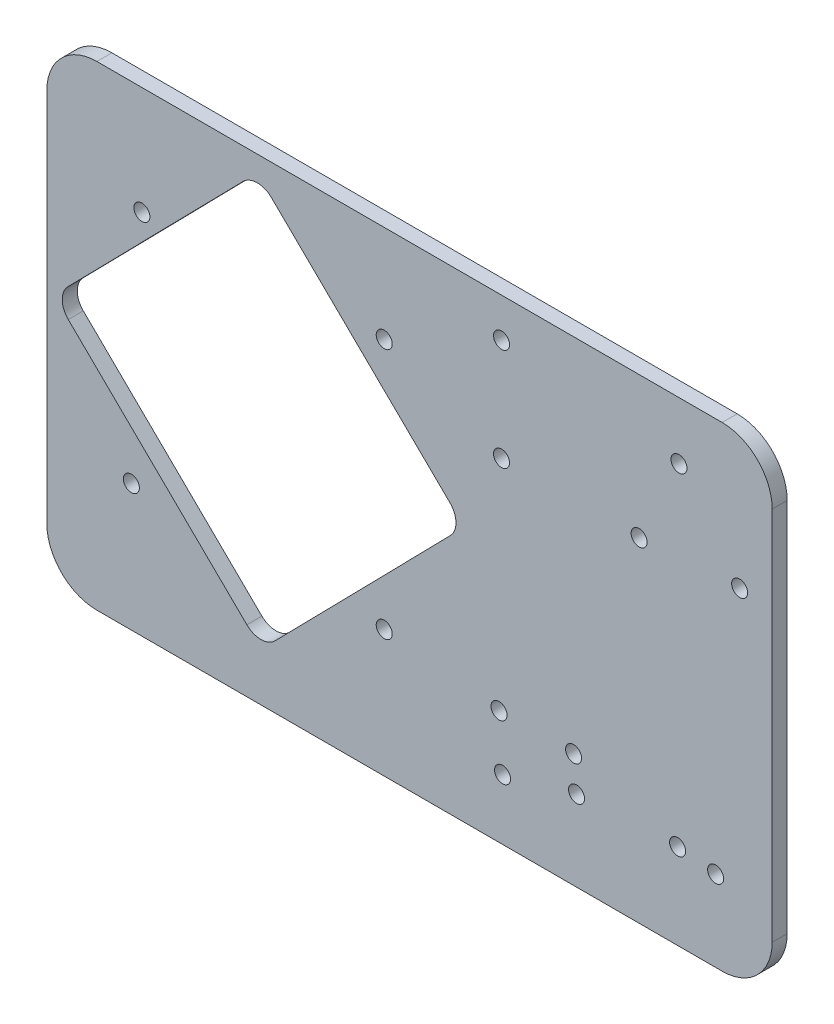
ISO-10303-21;
HEADER;
FILE_DESCRIPTION(('STEP AP214'),'2;1');
FILE_NAME('part.step','',(''),(''),'','','');
FILE_SCHEMA(('AUTOMOTIVE_DESIGN { 1 0 10303 214 1 1 1 1 }'));
ENDSEC;
DATA;
#1=APPLICATION_CONTEXT('core data for automotive mechanical design processes');
#2=APPLICATION_PROTOCOL_DEFINITION('international standard','automotive_design',2000,#1);
#3=PRODUCT_CONTEXT('',#1,'mechanical');
#4=PRODUCT('Part','Part','',(#3));
#5=PRODUCT_RELATED_PRODUCT_CATEGORY('part','',(#4));
#6=PRODUCT_DEFINITION_FORMATION('','',#4);
#7=PRODUCT_DEFINITION_CONTEXT('part definition',#1,'design');
#8=PRODUCT_DEFINITION('design','',#6,#7);
#9=PRODUCT_DEFINITION_SHAPE('','',#8);
#10=(LENGTH_UNIT() NAMED_UNIT(*) SI_UNIT(.MILLI.,.METRE.));
#11=(NAMED_UNIT(*) PLANE_ANGLE_UNIT() SI_UNIT($,.RADIAN.));
#12=(NAMED_UNIT(*) SI_UNIT($,.STERADIAN.) SOLID_ANGLE_UNIT());
#13=UNCERTAINTY_MEASURE_WITH_UNIT(LENGTH_MEASURE(1.E-05),#10,'distance_accuracy_value','');
#14=(GEOMETRIC_REPRESENTATION_CONTEXT(3) GLOBAL_UNCERTAINTY_ASSIGNED_CONTEXT((#13)) GLOBAL_UNIT_ASSIGNED_CONTEXT((#10,
#11,#12)) REPRESENTATION_CONTEXT('',''));
#15=CARTESIAN_POINT('',(0.,0.,0.));
#16=DIRECTION('',(0.,0.,1.));
#17=DIRECTION('',(1.,0.,0.));
#18=AXIS2_PLACEMENT_3D('',#15,#16,#17);
#19=CARTESIAN_POINT('',(135.,85.,-3.));
#20=DIRECTION('',(0.,0.,1.));
#21=DIRECTION('',(1.,0.,0.));
#22=AXIS2_PLACEMENT_3D('',#19,#20,#21);
#23=CYLINDRICAL_SURFACE('',#22,10.);
#24=CARTESIAN_POINT('',(135.,85.,0.));
#25=DIRECTION('',(0.,0.,1.));
#26=DIRECTION('',(-1.,0.,0.));
#27=AXIS2_PLACEMENT_3D('',#24,#25,#26);
#28=CIRCLE('',#27,10.);
#29=CARTESIAN_POINT('',(145.,84.9999999999999,0.));
#30=VERTEX_POINT('',#29);
#31=CARTESIAN_POINT('',(135.,95.,0.));
#32=VERTEX_POINT('',#31);
#33=EDGE_CURVE('E227',#30,#32,#28,.T.);
#34=ORIENTED_EDGE('',*,*,#33,.F.);
#35=DIRECTION('',(0.,0.,1.));
#36=VECTOR('',#35,1.);
#37=CARTESIAN_POINT('',(145.,84.9999999999999,-3.));
#38=LINE('',#37,#36);
#39=CARTESIAN_POINT('',(145.,84.9999999999999,-3.));
#40=VERTEX_POINT('',#39);
#41=EDGE_CURVE('E11',#40,#30,#38,.T.);
#42=ORIENTED_EDGE('',*,*,#41,.F.);
#43=CARTESIAN_POINT('',(135.,85.,-3.));
#44=DIRECTION('',(0.,0.,1.));
#45=DIRECTION('',(-1.,0.,0.));
#46=AXIS2_PLACEMENT_3D('',#43,#44,#45);
#47=CIRCLE('',#46,10.);
#48=CARTESIAN_POINT('',(135.,95.,-3.));
#49=VERTEX_POINT('',#48);
#50=EDGE_CURVE('E230',#40,#49,#47,.T.);
#51=ORIENTED_EDGE('',*,*,#50,.T.);
#52=DIRECTION('',(0.,0.,1.));
#53=VECTOR('',#52,1.);
#54=CARTESIAN_POINT('',(135.,95.,-3.));
#55=LINE('',#54,#53);
#56=EDGE_CURVE('E41',#49,#32,#55,.T.);
#57=ORIENTED_EDGE('',*,*,#56,.T.);
#58=EDGE_LOOP('',(#34,#42,#51,#57));
#59=FACE_BOUND('',#58,.T.);
#60=ADVANCED_FACE('F38',(#59),#23,.T.);
#61=CARTESIAN_POINT('',(145.,10.0000000000001,-3.));
#62=DIRECTION('',(1.,0.,0.));
#63=DIRECTION('',(0.,0.,-1.));
#64=AXIS2_PLACEMENT_3D('',#61,#62,#63);
#65=PLANE('',#64);
#66=DIRECTION('',(0.,1.,0.));
#67=VECTOR('',#66,1.);
#68=CARTESIAN_POINT('',(145.,10.0000000000001,0.));
#69=LINE('',#68,#67);
#70=CARTESIAN_POINT('',(145.,10.,0.));
#71=VERTEX_POINT('',#70);
#72=EDGE_CURVE('E234',#71,#30,#69,.T.);
#73=ORIENTED_EDGE('',*,*,#72,.F.);
#74=DIRECTION('',(0.,0.,1.));
#75=VECTOR('',#74,1.);
#76=CARTESIAN_POINT('',(145.,10.,-3.));
#77=LINE('',#76,#75);
#78=CARTESIAN_POINT('',(145.,10.,-3.));
#79=VERTEX_POINT('',#78);
#80=EDGE_CURVE('E46',#79,#71,#77,.T.);
#81=ORIENTED_EDGE('',*,*,#80,.F.);
#82=DIRECTION('',(0.,1.,0.));
#83=VECTOR('',#82,1.);
#84=CARTESIAN_POINT('',(145.,10.0000000000001,-3.));
#85=LINE('',#84,#83);
#86=EDGE_CURVE('E252',#79,#40,#85,.T.);
#87=ORIENTED_EDGE('',*,*,#86,.T.);
#88=ORIENTED_EDGE('',*,*,#41,.T.);
#89=EDGE_LOOP('',(#73,#81,#87,#88));
#90=FACE_BOUND('',#89,.T.);
#91=ADVANCED_FACE('F299',(#90),#65,.T.);
#92=CARTESIAN_POINT('',(135.,10.,-3.));
#93=DIRECTION('',(0.,0.,1.));
#94=DIRECTION('',(1.,0.,0.));
#95=AXIS2_PLACEMENT_3D('',#92,#93,#94);
#96=CYLINDRICAL_SURFACE('',#95,10.);
#97=CARTESIAN_POINT('',(135.,10.,0.));
#98=DIRECTION('',(0.,0.,1.));
#99=DIRECTION('',(1.,0.,0.));
#100=AXIS2_PLACEMENT_3D('',#97,#98,#99);
#101=CIRCLE('',#100,10.);
#102=CARTESIAN_POINT('',(135.,0.,0.));
#103=VERTEX_POINT('',#102);
#104=EDGE_CURVE('E272',#103,#71,#101,.T.);
#105=ORIENTED_EDGE('',*,*,#104,.F.);
#106=DIRECTION('',(0.,0.,1.));
#107=VECTOR('',#106,1.);
#108=CARTESIAN_POINT('',(135.,0.,-3.));
#109=LINE('',#108,#107);
#110=CARTESIAN_POINT('',(135.,0.,-3.));
#111=VERTEX_POINT('',#110);
#112=EDGE_CURVE('E278',#111,#103,#109,.T.);
#113=ORIENTED_EDGE('',*,*,#112,.F.);
#114=CARTESIAN_POINT('',(135.,10.,-3.));
#115=DIRECTION('',(0.,0.,1.));
#116=DIRECTION('',(1.,0.,0.));
#117=AXIS2_PLACEMENT_3D('',#114,#115,#116);
#118=CIRCLE('',#117,10.);
#119=EDGE_CURVE('E249',#111,#79,#118,.T.);
#120=ORIENTED_EDGE('',*,*,#119,.T.);
#121=ORIENTED_EDGE('',*,*,#80,.T.);
#122=EDGE_LOOP('',(#105,#113,#120,#121));
#123=FACE_BOUND('',#122,.T.);
#124=ADVANCED_FACE('F319',(#123),#96,.T.);
#125=CARTESIAN_POINT('',(10.0000000000001,0.,-3.));
#126=DIRECTION('',(0.,-1.,0.));
#127=DIRECTION('',(0.,0.,-1.));
#128=AXIS2_PLACEMENT_3D('',#125,#126,#127);
#129=PLANE('',#128);
#130=DIRECTION('',(1.,0.,0.));
#131=VECTOR('',#130,1.);
#132=CARTESIAN_POINT('',(10.0000000000001,0.,0.));
#133=LINE('',#132,#131);
#134=CARTESIAN_POINT('',(10.0000000000001,0.,0.));
#135=VERTEX_POINT('',#134);
#136=EDGE_CURVE('E269',#135,#103,#133,.T.);
#137=ORIENTED_EDGE('',*,*,#136,.F.);
#138=DIRECTION('',(0.,0.,1.));
#139=VECTOR('',#138,1.);
#140=CARTESIAN_POINT('',(10.0000000000001,0.,-3.));
#141=LINE('',#140,#139);
#142=CARTESIAN_POINT('',(10.0000000000001,0.,-3.));
#143=VERTEX_POINT('',#142);
#144=EDGE_CURVE('E280',#143,#135,#141,.T.);
#145=ORIENTED_EDGE('',*,*,#144,.F.);
#146=DIRECTION('',(1.,0.,0.));
#147=VECTOR('',#146,1.);
#148=CARTESIAN_POINT('',(10.0000000000001,0.,-3.));
#149=LINE('',#148,#147);
#150=EDGE_CURVE('E246',#143,#111,#149,.T.);
#151=ORIENTED_EDGE('',*,*,#150,.T.);
#152=ORIENTED_EDGE('',*,*,#112,.T.);
#153=EDGE_LOOP('',(#137,#145,#151,#152));
#154=FACE_BOUND('',#153,.T.);
#155=ADVANCED_FACE('F317',(#154),#129,.T.);
#156=CARTESIAN_POINT('',(10.,10.,-3.));
#157=DIRECTION('',(0.,0.,1.));
#158=DIRECTION('',(1.,0.,0.));
#159=AXIS2_PLACEMENT_3D('',#156,#157,#158);
#160=CYLINDRICAL_SURFACE('',#159,10.);
#161=CARTESIAN_POINT('',(10.,10.,0.));
#162=DIRECTION('',(0.,0.,1.));
#163=DIRECTION('',(-1.,0.,0.));
#164=AXIS2_PLACEMENT_3D('',#161,#162,#163);
#165=CIRCLE('',#164,10.);
#166=CARTESIAN_POINT('',(0.,10.0000000000001,0.));
#167=VERTEX_POINT('',#166);
#168=EDGE_CURVE('E266',#167,#135,#165,.T.);
#169=ORIENTED_EDGE('',*,*,#168,.F.);
#170=DIRECTION('',(0.,0.,1.));
#171=VECTOR('',#170,1.);
#172=CARTESIAN_POINT('',(0.,10.0000000000001,-3.));
#173=LINE('',#172,#171);
#174=CARTESIAN_POINT('',(0.,10.0000000000001,-3.));
#175=VERTEX_POINT('',#174);
#176=EDGE_CURVE('E282',#175,#167,#173,.T.);
#177=ORIENTED_EDGE('',*,*,#176,.F.);
#178=CARTESIAN_POINT('',(10.,10.,-3.));
#179=DIRECTION('',(0.,0.,1.));
#180=DIRECTION('',(-1.,0.,0.));
#181=AXIS2_PLACEMENT_3D('',#178,#179,#180);
#182=CIRCLE('',#181,10.);
#183=EDGE_CURVE('E243',#175,#143,#182,.T.);
#184=ORIENTED_EDGE('',*,*,#183,.T.);
#185=ORIENTED_EDGE('',*,*,#144,.T.);
#186=EDGE_LOOP('',(#169,#177,#184,#185));
#187=FACE_BOUND('',#186,.T.);
#188=ADVANCED_FACE('F313',(#187),#160,.T.);
#189=CARTESIAN_POINT('',(0.,10.0000000000001,-3.));
#190=DIRECTION('',(-1.,0.,0.));
#191=DIRECTION('',(0.,0.,1.));
#192=AXIS2_PLACEMENT_3D('',#189,#190,#191);
#193=PLANE('',#192);
#194=DIRECTION('',(0.,-1.,0.));
#195=VECTOR('',#194,1.);
#196=CARTESIAN_POINT('',(0.,10.0000000000001,0.));
#197=LINE('',#196,#195);
#198=CARTESIAN_POINT('',(0.,84.9999999999999,0.));
#199=VERTEX_POINT('',#198);
#200=EDGE_CURVE('E263',#199,#167,#197,.T.);
#201=ORIENTED_EDGE('',*,*,#200,.F.);
#202=DIRECTION('',(0.,0.,1.));
#203=VECTOR('',#202,1.);
#204=CARTESIAN_POINT('',(0.,84.9999999999999,-3.));
#205=LINE('',#204,#203);
#206=CARTESIAN_POINT('',(0.,84.9999999999999,-3.));
#207=VERTEX_POINT('',#206);
#208=EDGE_CURVE('E284',#207,#199,#205,.T.);
#209=ORIENTED_EDGE('',*,*,#208,.F.);
#210=DIRECTION('',(0.,-1.,0.));
#211=VECTOR('',#210,1.);
#212=CARTESIAN_POINT('',(0.,10.0000000000001,-3.));
#213=LINE('',#212,#211);
#214=EDGE_CURVE('E240',#207,#175,#213,.T.);
#215=ORIENTED_EDGE('',*,*,#214,.T.);
#216=ORIENTED_EDGE('',*,*,#176,.T.);
#217=EDGE_LOOP('',(#201,#209,#215,#216));
#218=FACE_BOUND('',#217,.T.);
#219=ADVANCED_FACE('F311',(#218),#193,.T.);
#220=CARTESIAN_POINT('',(10.,85.,-3.));
#221=DIRECTION('',(0.,0.,1.));
#222=DIRECTION('',(1.,0.,0.));
#223=AXIS2_PLACEMENT_3D('',#220,#221,#222);
#224=CYLINDRICAL_SURFACE('',#223,10.);
#225=CARTESIAN_POINT('',(10.,85.,0.));
#226=DIRECTION('',(0.,0.,1.));
#227=DIRECTION('',(-1.,0.,0.));
#228=AXIS2_PLACEMENT_3D('',#225,#226,#227);
#229=CIRCLE('',#228,10.);
#230=CARTESIAN_POINT('',(10.0000000000001,95.,0.));
#231=VERTEX_POINT('',#230);
#232=EDGE_CURVE('E260',#231,#199,#229,.T.);
#233=ORIENTED_EDGE('',*,*,#232,.F.);
#234=DIRECTION('',(0.,0.,1.));
#235=VECTOR('',#234,1.);
#236=CARTESIAN_POINT('',(10.0000000000001,95.,-3.));
#237=LINE('',#236,#235);
#238=CARTESIAN_POINT('',(10.0000000000001,95.,-3.));
#239=VERTEX_POINT('',#238);
#240=EDGE_CURVE('E285',#239,#231,#237,.T.);
#241=ORIENTED_EDGE('',*,*,#240,.F.);
#242=CARTESIAN_POINT('',(10.,85.,-3.));
#243=DIRECTION('',(0.,0.,1.));
#244=DIRECTION('',(-1.,0.,0.));
#245=AXIS2_PLACEMENT_3D('',#242,#243,#244);
#246=CIRCLE('',#245,10.);
#247=EDGE_CURVE('E237',#239,#207,#246,.T.);
#248=ORIENTED_EDGE('',*,*,#247,.T.);
#249=ORIENTED_EDGE('',*,*,#208,.T.);
#250=EDGE_LOOP('',(#233,#241,#248,#249));
#251=FACE_BOUND('',#250,.T.);
#252=ADVANCED_FACE('F307',(#251),#224,.T.);
#253=CARTESIAN_POINT('',(10.0000000000001,95.,-3.));
#254=DIRECTION('',(0.,1.,0.));
#255=DIRECTION('',(0.,0.,1.));
#256=AXIS2_PLACEMENT_3D('',#253,#254,#255);
#257=PLANE('',#256);
#258=DIRECTION('',(-1.,0.,0.));
#259=VECTOR('',#258,1.);
#260=CARTESIAN_POINT('',(10.0000000000001,95.,0.));
#261=LINE('',#260,#259);
#262=EDGE_CURVE('E257',#32,#231,#261,.T.);
#263=ORIENTED_EDGE('',*,*,#262,.F.);
#264=ORIENTED_EDGE('',*,*,#56,.F.);
#265=DIRECTION('',(-1.,0.,0.));
#266=VECTOR('',#265,1.);
#267=CARTESIAN_POINT('',(10.0000000000001,95.,-3.));
#268=LINE('',#267,#266);
#269=EDGE_CURVE('E233',#49,#239,#268,.T.);
#270=ORIENTED_EDGE('',*,*,#269,.T.);
#271=ORIENTED_EDGE('',*,*,#240,.T.);
#272=EDGE_LOOP('',(#263,#264,#270,#271));
#273=FACE_BOUND('',#272,.T.);
#274=ADVANCED_FACE('F293',(#273),#257,.T.);
#275=CARTESIAN_POINT('',(135.,85.,-3.));
#276=DIRECTION('',(0.,0.,-1.));
#277=DIRECTION('',(-1.,0.,0.));
#278=AXIS2_PLACEMENT_3D('',#275,#276,#277);
#279=PLANE('',#278);
#280=CARTESIAN_POINT('',(16.9,25.4,-3.));
#281=DIRECTION('',(0.,0.,1.));
#282=DIRECTION('',(1.,0.,0.));
#283=AXIS2_PLACEMENT_3D('',#280,#281,#282);
#284=CIRCLE('',#283,1.60000000000001);
#285=CARTESIAN_POINT('',(18.5,25.4,-3.));
#286=VERTEX_POINT('',#285);
#287=EDGE_CURVE('E694',#286,#286,#284,.T.);
#288=ORIENTED_EDGE('',*,*,#287,.T.);
#289=EDGE_LOOP('',(#288));
#290=FACE_BOUND('',#289,.T.);
#291=CARTESIAN_POINT('',(105.9,16.1,-3.));
#292=DIRECTION('',(0.,0.,1.));
#293=DIRECTION('',(1.,0.,0.));
#294=AXIS2_PLACEMENT_3D('',#291,#292,#293);
#295=CIRCLE('',#294,1.6);
#296=CARTESIAN_POINT('',(107.5,16.1,-3.));
#297=VERTEX_POINT('',#296);
#298=EDGE_CURVE('E702',#297,#297,#295,.T.);
#299=ORIENTED_EDGE('',*,*,#298,.T.);
#300=EDGE_LOOP('',(#299));
#301=FACE_BOUND('',#300,.T.);
#302=CARTESIAN_POINT('',(67.45,75.6,-3.));
#303=DIRECTION('',(0.,0.,1.));
#304=DIRECTION('',(1.,0.,0.));
#305=AXIS2_PLACEMENT_3D('',#302,#303,#304);
#306=CIRCLE('',#305,1.60000000000001);
#307=CARTESIAN_POINT('',(69.05,75.6,-3.));
#308=VERTEX_POINT('',#307);
#309=EDGE_CURVE('E708',#308,#308,#306,.T.);
#310=ORIENTED_EDGE('',*,*,#309,.T.);
#311=EDGE_LOOP('',(#310));
#312=FACE_BOUND('',#311,.T.);
#313=CARTESIAN_POINT('',(91.1,12.1,-3.));
#314=DIRECTION('',(0.,0.,1.));
#315=DIRECTION('',(1.,0.,0.));
#316=AXIS2_PLACEMENT_3D('',#313,#314,#315);
#317=CIRCLE('',#316,1.6);
#318=CARTESIAN_POINT('',(92.7,12.1,-3.));
#319=VERTEX_POINT('',#318);
#320=EDGE_CURVE('E714',#319,#319,#317,.T.);
#321=ORIENTED_EDGE('',*,*,#320,.T.);
#322=EDGE_LOOP('',(#321));
#323=FACE_BOUND('',#322,.T.);
#324=CARTESIAN_POINT('',(19.,73.4,-3.));
#325=DIRECTION('',(0.,0.,1.));
#326=DIRECTION('',(1.,0.,0.));
#327=AXIS2_PLACEMENT_3D('',#324,#325,#326);
#328=CIRCLE('',#327,1.60000000000001);
#329=CARTESIAN_POINT('',(20.6,73.4,-3.));
#330=VERTEX_POINT('',#329);
#331=EDGE_CURVE('E720',#330,#330,#328,.T.);
#332=ORIENTED_EDGE('',*,*,#331,.T.);
#333=EDGE_LOOP('',(#332));
#334=FACE_BOUND('',#333,.T.);
#335=CARTESIAN_POINT('',(90.4,22.8,-3.));
#336=DIRECTION('',(0.,0.,1.));
#337=DIRECTION('',(1.,0.,0.));
#338=AXIS2_PLACEMENT_3D('',#335,#336,#337);
#339=CIRCLE('',#338,1.6);
#340=CARTESIAN_POINT('',(92.,22.8,-3.));
#341=VERTEX_POINT('',#340);
#342=EDGE_CURVE('E726',#341,#341,#339,.T.);
#343=ORIENTED_EDGE('',*,*,#342,.T.);
#344=EDGE_LOOP('',(#343));
#345=FACE_BOUND('',#344,.T.);
#346=CARTESIAN_POINT('',(105.3,22.8,-3.));
#347=DIRECTION('',(0.,0.,1.));
#348=DIRECTION('',(1.,0.,0.));
#349=AXIS2_PLACEMENT_3D('',#346,#347,#348);
#350=CIRCLE('',#349,1.6);
#351=CARTESIAN_POINT('',(106.9,22.8,-3.));
#352=VERTEX_POINT('',#351);
#353=EDGE_CURVE('E732',#352,#352,#350,.T.);
#354=ORIENTED_EDGE('',*,*,#353,.T.);
#355=EDGE_LOOP('',(#354));
#356=FACE_BOUND('',#355,.T.);
#357=CARTESIAN_POINT('',(133.7,16.15,-3.));
#358=DIRECTION('',(0.,0.,1.));
#359=DIRECTION('',(1.,0.,0.));
#360=AXIS2_PLACEMENT_3D('',#357,#358,#359);
#361=CIRCLE('',#360,1.60000000000002);
#362=CARTESIAN_POINT('',(135.3,16.15,-3.));
#363=VERTEX_POINT('',#362);
#364=EDGE_CURVE('E738',#363,#363,#361,.T.);
#365=ORIENTED_EDGE('',*,*,#364,.T.);
#366=EDGE_LOOP('',(#365));
#367=FACE_BOUND('',#366,.T.);
#368=CARTESIAN_POINT('',(67.45,25.4,-3.));
#369=DIRECTION('',(0.,0.,1.));
#370=DIRECTION('',(1.,0.,0.));
#371=AXIS2_PLACEMENT_3D('',#368,#369,#370);
#372=CIRCLE('',#371,1.6);
#373=CARTESIAN_POINT('',(69.05,25.4,-3.));
#374=VERTEX_POINT('',#373);
#375=EDGE_CURVE('E744',#374,#374,#372,.T.);
#376=ORIENTED_EDGE('',*,*,#375,.T.);
#377=EDGE_LOOP('',(#376));
#378=FACE_BOUND('',#377,.T.);
#379=CARTESIAN_POINT('',(90.9,66.7485695303356,-3.));
#380=DIRECTION('',(0.,0.,1.));
#381=DIRECTION('',(1.,0.,0.));
#382=AXIS2_PLACEMENT_3D('',#379,#380,#381);
#383=CIRCLE('',#382,1.60000000000001);
#384=CARTESIAN_POINT('',(92.5,66.7485695303356,-3.));
#385=VERTEX_POINT('',#384);
#386=EDGE_CURVE('E750',#385,#385,#383,.T.);
#387=ORIENTED_EDGE('',*,*,#386,.T.);
#388=EDGE_LOOP('',(#387));
#389=FACE_BOUND('',#388,.T.);
#390=CARTESIAN_POINT('',(126.1,17.1,-3.));
#391=DIRECTION('',(0.,0.,1.));
#392=DIRECTION('',(1.,0.,0.));
#393=AXIS2_PLACEMENT_3D('',#390,#391,#392);
#394=CIRCLE('',#393,1.60000000000002);
#395=CARTESIAN_POINT('',(127.7,17.1,-3.));
#396=VERTEX_POINT('',#395);
#397=EDGE_CURVE('E756',#396,#396,#394,.T.);
#398=ORIENTED_EDGE('',*,*,#397,.T.);
#399=EDGE_LOOP('',(#398));
#400=FACE_BOUND('',#399,.T.);
#401=CARTESIAN_POINT('',(118.4,66.7485695303356,-3.));
#402=DIRECTION('',(0.,0.,1.));
#403=DIRECTION('',(1.,0.,0.));
#404=AXIS2_PLACEMENT_3D('',#401,#402,#403);
#405=CIRCLE('',#404,1.60000000000001);
#406=CARTESIAN_POINT('',(120.,66.7485695303356,-3.));
#407=VERTEX_POINT('',#406);
#408=EDGE_CURVE('E762',#407,#407,#405,.T.);
#409=ORIENTED_EDGE('',*,*,#408,.T.);
#410=EDGE_LOOP('',(#409));
#411=FACE_BOUND('',#410,.T.);
#412=CARTESIAN_POINT('',(138.5,68.05,-3.));
#413=DIRECTION('',(0.,0.,1.));
#414=DIRECTION('',(1.,0.,0.));
#415=AXIS2_PLACEMENT_3D('',#412,#413,#414);
#416=CIRCLE('',#415,1.60000000000002);
#417=CARTESIAN_POINT('',(140.1,68.05,-3.));
#418=VERTEX_POINT('',#417);
#419=EDGE_CURVE('E768',#418,#418,#416,.T.);
#420=ORIENTED_EDGE('',*,*,#419,.T.);
#421=EDGE_LOOP('',(#420));
#422=FACE_BOUND('',#421,.T.);
#423=CARTESIAN_POINT('',(90.9,87.2,-3.));
#424=DIRECTION('',(0.,0.,1.));
#425=DIRECTION('',(1.,0.,0.));
#426=AXIS2_PLACEMENT_3D('',#423,#424,#425);
#427=CIRCLE('',#426,1.60000000000001);
#428=CARTESIAN_POINT('',(92.5,87.2,-3.));
#429=VERTEX_POINT('',#428);
#430=EDGE_CURVE('E194',#429,#429,#427,.T.);
#431=ORIENTED_EDGE('',*,*,#430,.T.);
#432=EDGE_LOOP('',(#431));
#433=FACE_BOUND('',#432,.T.);
#434=CARTESIAN_POINT('',(77.7905377314787,51.0347681658516,-3.));
#435=DIRECTION('',(0.,0.,1.));
#436=DIRECTION('',(-1.,0.,0.));
#437=AXIS2_PLACEMENT_3D('',#434,#435,#436);
#438=CIRCLE('',#437,3.99999999999998);
#439=CARTESIAN_POINT('',(80.6472012928225,48.2348622214866,-3.));
#440=VERTEX_POINT('',#439);
#441=CARTESIAN_POINT('',(80.5904436758436,53.8914317271954,-3.));
#442=VERTEX_POINT('',#441);
#443=EDGE_CURVE('E153',#440,#442,#438,.T.);
#444=ORIENTED_EDGE('',*,*,#443,.T.);
#445=DIRECTION('',(-0.714165890335961,0.699976486091244,0.));
#446=VECTOR('',#445,1.);
#447=CARTESIAN_POINT('',(44.8821491590456,88.8902560317576,-3.));
#448=LINE('',#447,#446);
#449=CARTESIAN_POINT('',(44.8821491590456,88.8902560317576,-3.));
#450=VERTEX_POINT('',#449);
#451=EDGE_CURVE('E162',#442,#450,#448,.T.);
#452=ORIENTED_EDGE('',*,*,#451,.T.);
#453=CARTESIAN_POINT('',(42.0822432146806,86.0335924704137,-3.));
#454=DIRECTION('',(0.,0.,1.));
#455=DIRECTION('',(1.,0.,0.));
#456=AXIS2_PLACEMENT_3D('',#453,#454,#455);
#457=CIRCLE('',#456,4.);
#458=CARTESIAN_POINT('',(39.2255796533368,88.8334984147787,-3.));
#459=VERTEX_POINT('',#458);
#460=EDGE_CURVE('E54',#450,#459,#457,.T.);
#461=ORIENTED_EDGE('',*,*,#460,.T.);
#462=DIRECTION('',(-0.699976486091246,-0.714165890335958,0.));
#463=VECTOR('',#462,1.);
#464=CARTESIAN_POINT('',(39.2255796533368,88.8334984147787,-3.));
#465=LINE('',#464,#463);
#466=CARTESIAN_POINT('',(4.22675534877451,53.1252038979808,-3.));
#467=VERTEX_POINT('',#466);
#468=EDGE_CURVE('E180',#459,#467,#465,.T.);
#469=ORIENTED_EDGE('',*,*,#468,.T.);
#470=CARTESIAN_POINT('',(7.08341891011833,50.3252979536158,-3.));
#471=DIRECTION('',(0.,0.,1.));
#472=DIRECTION('',(-1.,0.,0.));
#473=AXIS2_PLACEMENT_3D('',#470,#471,#472);
#474=CIRCLE('',#473,4.);
#475=CARTESIAN_POINT('',(4.28351296575338,47.468634392272,-3.));
#476=VERTEX_POINT('',#475);
#477=EDGE_CURVE('E183',#467,#476,#474,.T.);
#478=ORIENTED_EDGE('',*,*,#477,.T.);
#479=DIRECTION('',(0.71416589033596,-0.699976486091244,0.));
#480=VECTOR('',#479,1.);
#481=CARTESIAN_POINT('',(4.28351296575337,47.468634392272,-3.));
#482=LINE('',#481,#480);
#483=CARTESIAN_POINT('',(39.9918074825514,12.4698100877098,-3.));
#484=VERTEX_POINT('',#483);
#485=EDGE_CURVE('E186',#476,#484,#482,.T.);
#486=ORIENTED_EDGE('',*,*,#485,.T.);
#487=CARTESIAN_POINT('',(42.7917134269164,15.3264736490537,-3.));
#488=DIRECTION('',(0.,0.,1.));
#489=DIRECTION('',(1.,0.,0.));
#490=AXIS2_PLACEMENT_3D('',#487,#488,#489);
#491=CIRCLE('',#490,4.00000000000001);
#492=CARTESIAN_POINT('',(45.6483769882602,12.5265677046887,-3.));
#493=VERTEX_POINT('',#492);
#494=EDGE_CURVE('E189',#484,#493,#491,.T.);
#495=ORIENTED_EDGE('',*,*,#494,.T.);
#496=DIRECTION('',(0.699976486091246,0.714165890335958,0.));
#497=VECTOR('',#496,1.);
#498=CARTESIAN_POINT('',(45.6483769882602,12.5265677046887,-3.));
#499=LINE('',#498,#497);
#500=EDGE_CURVE('E159',#493,#440,#499,.T.);
#501=ORIENTED_EDGE('',*,*,#500,.T.);
#502=EDGE_LOOP('',(#444,#452,#461,#469,#478,#486,#495,#501));
#503=FACE_BOUND('',#502,.T.);
#504=CARTESIAN_POINT('',(126.368886423393,83.5358405283628,-3.));
#505=DIRECTION('',(0.,0.,1.));
#506=DIRECTION('',(1.,0.,0.));
#507=AXIS2_PLACEMENT_3D('',#504,#505,#506);
#508=CIRCLE('',#507,1.59999999999999);
#509=CARTESIAN_POINT('',(127.968886423393,83.5358405283628,-3.));
#510=VERTEX_POINT('',#509);
#511=EDGE_CURVE('E224',#510,#510,#508,.T.);
#512=ORIENTED_EDGE('',*,*,#511,.T.);
#513=EDGE_LOOP('',(#512));
#514=FACE_BOUND('',#513,.T.);
#515=ORIENTED_EDGE('',*,*,#50,.F.);
#516=ORIENTED_EDGE('',*,*,#86,.F.);
#517=ORIENTED_EDGE('',*,*,#119,.F.);
#518=ORIENTED_EDGE('',*,*,#150,.F.);
#519=ORIENTED_EDGE('',*,*,#183,.F.);
#520=ORIENTED_EDGE('',*,*,#214,.F.);
#521=ORIENTED_EDGE('',*,*,#247,.F.);
#522=ORIENTED_EDGE('',*,*,#269,.F.);
#523=EDGE_LOOP('',(#515,#516,#517,#518,#519,#520,#521,#522));
#524=FACE_BOUND('',#523,.T.);
#525=ADVANCED_FACE('F166',(#290,#301,#312,#323,#334,#345,#356,#367,#378,#389,#400,#411,#422,
#433,#503,#514,#524),#279,.T.);
#526=CARTESIAN_POINT('',(135.,85.,0.));
#527=DIRECTION('',(0.,0.,-1.));
#528=DIRECTION('',(-1.,0.,0.));
#529=AXIS2_PLACEMENT_3D('',#526,#527,#528);
#530=PLANE('',#529);
#531=CARTESIAN_POINT('',(16.9,25.4,0.));
#532=DIRECTION('',(0.,0.,1.));
#533=DIRECTION('',(1.,0.,0.));
#534=AXIS2_PLACEMENT_3D('',#531,#532,#533);
#535=CIRCLE('',#534,1.60000000000001);
#536=CARTESIAN_POINT('',(18.5,25.4,0.));
#537=VERTEX_POINT('',#536);
#538=EDGE_CURVE('E697',#537,#537,#535,.T.);
#539=ORIENTED_EDGE('',*,*,#538,.F.);
#540=EDGE_LOOP('',(#539));
#541=FACE_BOUND('',#540,.T.);
#542=CARTESIAN_POINT('',(105.9,16.1,0.));
#543=DIRECTION('',(0.,0.,1.));
#544=DIRECTION('',(1.,0.,0.));
#545=AXIS2_PLACEMENT_3D('',#542,#543,#544);
#546=CIRCLE('',#545,1.6);
#547=CARTESIAN_POINT('',(107.5,16.1,0.));
#548=VERTEX_POINT('',#547);
#549=EDGE_CURVE('E699',#548,#548,#546,.T.);
#550=ORIENTED_EDGE('',*,*,#549,.F.);
#551=EDGE_LOOP('',(#550));
#552=FACE_BOUND('',#551,.T.);
#553=CARTESIAN_POINT('',(67.45,75.6,0.));
#554=DIRECTION('',(0.,0.,1.));
#555=DIRECTION('',(1.,0.,0.));
#556=AXIS2_PLACEMENT_3D('',#553,#554,#555);
#557=CIRCLE('',#556,1.60000000000001);
#558=CARTESIAN_POINT('',(69.05,75.6,0.));
#559=VERTEX_POINT('',#558);
#560=EDGE_CURVE('E705',#559,#559,#557,.T.);
#561=ORIENTED_EDGE('',*,*,#560,.F.);
#562=EDGE_LOOP('',(#561));
#563=FACE_BOUND('',#562,.T.);
#564=CARTESIAN_POINT('',(91.1,12.1,0.));
#565=DIRECTION('',(0.,0.,1.));
#566=DIRECTION('',(1.,0.,0.));
#567=AXIS2_PLACEMENT_3D('',#564,#565,#566);
#568=CIRCLE('',#567,1.6);
#569=CARTESIAN_POINT('',(92.7,12.1,0.));
#570=VERTEX_POINT('',#569);
#571=EDGE_CURVE('E711',#570,#570,#568,.T.);
#572=ORIENTED_EDGE('',*,*,#571,.F.);
#573=EDGE_LOOP('',(#572));
#574=FACE_BOUND('',#573,.T.);
#575=CARTESIAN_POINT('',(19.,73.4,0.));
#576=DIRECTION('',(0.,0.,1.));
#577=DIRECTION('',(1.,0.,0.));
#578=AXIS2_PLACEMENT_3D('',#575,#576,#577);
#579=CIRCLE('',#578,1.60000000000001);
#580=CARTESIAN_POINT('',(20.6,73.4,0.));
#581=VERTEX_POINT('',#580);
#582=EDGE_CURVE('E717',#581,#581,#579,.T.);
#583=ORIENTED_EDGE('',*,*,#582,.F.);
#584=EDGE_LOOP('',(#583));
#585=FACE_BOUND('',#584,.T.);
#586=CARTESIAN_POINT('',(90.4,22.8,0.));
#587=DIRECTION('',(0.,0.,1.));
#588=DIRECTION('',(1.,0.,0.));
#589=AXIS2_PLACEMENT_3D('',#586,#587,#588);
#590=CIRCLE('',#589,1.6);
#591=CARTESIAN_POINT('',(92.,22.8,0.));
#592=VERTEX_POINT('',#591);
#593=EDGE_CURVE('E723',#592,#592,#590,.T.);
#594=ORIENTED_EDGE('',*,*,#593,.F.);
#595=EDGE_LOOP('',(#594));
#596=FACE_BOUND('',#595,.T.);
#597=CARTESIAN_POINT('',(105.3,22.8,0.));
#598=DIRECTION('',(0.,0.,1.));
#599=DIRECTION('',(1.,0.,0.));
#600=AXIS2_PLACEMENT_3D('',#597,#598,#599);
#601=CIRCLE('',#600,1.6);
#602=CARTESIAN_POINT('',(106.9,22.8,0.));
#603=VERTEX_POINT('',#602);
#604=EDGE_CURVE('E729',#603,#603,#601,.T.);
#605=ORIENTED_EDGE('',*,*,#604,.F.);
#606=EDGE_LOOP('',(#605));
#607=FACE_BOUND('',#606,.T.);
#608=CARTESIAN_POINT('',(133.7,16.15,0.));
#609=DIRECTION('',(0.,0.,1.));
#610=DIRECTION('',(1.,0.,0.));
#611=AXIS2_PLACEMENT_3D('',#608,#609,#610);
#612=CIRCLE('',#611,1.60000000000002);
#613=CARTESIAN_POINT('',(135.3,16.15,0.));
#614=VERTEX_POINT('',#613);
#615=EDGE_CURVE('E735',#614,#614,#612,.T.);
#616=ORIENTED_EDGE('',*,*,#615,.F.);
#617=EDGE_LOOP('',(#616));
#618=FACE_BOUND('',#617,.T.);
#619=CARTESIAN_POINT('',(67.45,25.4,0.));
#620=DIRECTION('',(0.,0.,1.));
#621=DIRECTION('',(1.,0.,0.));
#622=AXIS2_PLACEMENT_3D('',#619,#620,#621);
#623=CIRCLE('',#622,1.6);
#624=CARTESIAN_POINT('',(69.05,25.4,0.));
#625=VERTEX_POINT('',#624);
#626=EDGE_CURVE('E741',#625,#625,#623,.T.);
#627=ORIENTED_EDGE('',*,*,#626,.F.);
#628=EDGE_LOOP('',(#627));
#629=FACE_BOUND('',#628,.T.);
#630=CARTESIAN_POINT('',(90.9,66.7485695303356,0.));
#631=DIRECTION('',(0.,0.,1.));
#632=DIRECTION('',(1.,0.,0.));
#633=AXIS2_PLACEMENT_3D('',#630,#631,#632);
#634=CIRCLE('',#633,1.60000000000001);
#635=CARTESIAN_POINT('',(92.5,66.7485695303356,0.));
#636=VERTEX_POINT('',#635);
#637=EDGE_CURVE('E747',#636,#636,#634,.T.);
#638=ORIENTED_EDGE('',*,*,#637,.F.);
#639=EDGE_LOOP('',(#638));
#640=FACE_BOUND('',#639,.T.);
#641=CARTESIAN_POINT('',(126.1,17.1,0.));
#642=DIRECTION('',(0.,0.,1.));
#643=DIRECTION('',(1.,0.,0.));
#644=AXIS2_PLACEMENT_3D('',#641,#642,#643);
#645=CIRCLE('',#644,1.60000000000002);
#646=CARTESIAN_POINT('',(127.7,17.1,0.));
#647=VERTEX_POINT('',#646);
#648=EDGE_CURVE('E753',#647,#647,#645,.T.);
#649=ORIENTED_EDGE('',*,*,#648,.F.);
#650=EDGE_LOOP('',(#649));
#651=FACE_BOUND('',#650,.T.);
#652=CARTESIAN_POINT('',(118.4,66.7485695303356,0.));
#653=DIRECTION('',(0.,0.,1.));
#654=DIRECTION('',(1.,0.,0.));
#655=AXIS2_PLACEMENT_3D('',#652,#653,#654);
#656=CIRCLE('',#655,1.60000000000001);
#657=CARTESIAN_POINT('',(120.,66.7485695303356,0.));
#658=VERTEX_POINT('',#657);
#659=EDGE_CURVE('E759',#658,#658,#656,.T.);
#660=ORIENTED_EDGE('',*,*,#659,.F.);
#661=EDGE_LOOP('',(#660));
#662=FACE_BOUND('',#661,.T.);
#663=CARTESIAN_POINT('',(138.5,68.05,0.));
#664=DIRECTION('',(0.,0.,1.));
#665=DIRECTION('',(1.,0.,0.));
#666=AXIS2_PLACEMENT_3D('',#663,#664,#665);
#667=CIRCLE('',#666,1.60000000000002);
#668=CARTESIAN_POINT('',(140.1,68.05,0.));
#669=VERTEX_POINT('',#668);
#670=EDGE_CURVE('E765',#669,#669,#667,.T.);
#671=ORIENTED_EDGE('',*,*,#670,.F.);
#672=EDGE_LOOP('',(#671));
#673=FACE_BOUND('',#672,.T.);
#674=CARTESIAN_POINT('',(90.9,87.2,0.));
#675=DIRECTION('',(0.,0.,1.));
#676=DIRECTION('',(1.,0.,0.));
#677=AXIS2_PLACEMENT_3D('',#674,#675,#676);
#678=CIRCLE('',#677,1.60000000000001);
#679=CARTESIAN_POINT('',(92.5,87.2,0.));
#680=VERTEX_POINT('',#679);
#681=EDGE_CURVE('E176',#680,#680,#678,.T.);
#682=ORIENTED_EDGE('',*,*,#681,.F.);
#683=EDGE_LOOP('',(#682));
#684=FACE_BOUND('',#683,.T.);
#685=DIRECTION('',(-0.714165890335961,0.699976486091244,0.));
#686=VECTOR('',#685,1.);
#687=CARTESIAN_POINT('',(44.8821491590456,88.8902560317576,0.));
#688=LINE('',#687,#686);
#689=CARTESIAN_POINT('',(80.5904436758436,53.8914317271954,0.));
#690=VERTEX_POINT('',#689);
#691=CARTESIAN_POINT('',(44.8821491590456,88.8902560317576,0.));
#692=VERTEX_POINT('',#691);
#693=EDGE_CURVE('E193',#690,#692,#688,.T.);
#694=ORIENTED_EDGE('',*,*,#693,.F.);
#695=CARTESIAN_POINT('',(77.7905377314787,51.0347681658516,0.));
#696=DIRECTION('',(0.,0.,1.));
#697=DIRECTION('',(-1.,0.,0.));
#698=AXIS2_PLACEMENT_3D('',#695,#696,#697);
#699=CIRCLE('',#698,3.99999999999998);
#700=CARTESIAN_POINT('',(80.6472012928225,48.2348622214866,0.));
#701=VERTEX_POINT('',#700);
#702=EDGE_CURVE('E62',#701,#690,#699,.T.);
#703=ORIENTED_EDGE('',*,*,#702,.F.);
#704=DIRECTION('',(0.699976486091246,0.714165890335958,0.));
#705=VECTOR('',#704,1.);
#706=CARTESIAN_POINT('',(45.6483769882602,12.5265677046887,0.));
#707=LINE('',#706,#705);
#708=CARTESIAN_POINT('',(45.6483769882602,12.5265677046887,0.));
#709=VERTEX_POINT('',#708);
#710=EDGE_CURVE('E170',#709,#701,#707,.T.);
#711=ORIENTED_EDGE('',*,*,#710,.F.);
#712=CARTESIAN_POINT('',(42.7917134269164,15.3264736490537,0.));
#713=DIRECTION('',(0.,0.,1.));
#714=DIRECTION('',(1.,0.,0.));
#715=AXIS2_PLACEMENT_3D('',#712,#713,#714);
#716=CIRCLE('',#715,4.00000000000001);
#717=CARTESIAN_POINT('',(39.9918074825514,12.4698100877098,0.));
#718=VERTEX_POINT('',#717);
#719=EDGE_CURVE('E173',#718,#709,#716,.T.);
#720=ORIENTED_EDGE('',*,*,#719,.F.);
#721=DIRECTION('',(0.71416589033596,-0.699976486091244,0.));
#722=VECTOR('',#721,1.);
#723=CARTESIAN_POINT('',(4.28351296575337,47.468634392272,0.));
#724=LINE('',#723,#722);
#725=CARTESIAN_POINT('',(4.28351296575338,47.468634392272,0.));
#726=VERTEX_POINT('',#725);
#727=EDGE_CURVE('E205',#726,#718,#724,.T.);
#728=ORIENTED_EDGE('',*,*,#727,.F.);
#729=CARTESIAN_POINT('',(7.08341891011833,50.3252979536158,0.));
#730=DIRECTION('',(0.,0.,1.));
#731=DIRECTION('',(-1.,0.,0.));
#732=AXIS2_PLACEMENT_3D('',#729,#730,#731);
#733=CIRCLE('',#732,4.);
#734=CARTESIAN_POINT('',(4.22675534877451,53.1252038979808,0.));
#735=VERTEX_POINT('',#734);
#736=EDGE_CURVE('E202',#735,#726,#733,.T.);
#737=ORIENTED_EDGE('',*,*,#736,.F.);
#738=DIRECTION('',(-0.699976486091246,-0.714165890335958,0.));
#739=VECTOR('',#738,1.);
#740=CARTESIAN_POINT('',(39.2255796533368,88.8334984147787,0.));
#741=LINE('',#740,#739);
#742=CARTESIAN_POINT('',(39.2255796533368,88.8334984147787,0.));
#743=VERTEX_POINT('',#742);
#744=EDGE_CURVE('E199',#743,#735,#741,.T.);
#745=ORIENTED_EDGE('',*,*,#744,.F.);
#746=CARTESIAN_POINT('',(42.0822432146806,86.0335924704137,0.));
#747=DIRECTION('',(0.,0.,1.));
#748=DIRECTION('',(1.,0.,0.));
#749=AXIS2_PLACEMENT_3D('',#746,#747,#748);
#750=CIRCLE('',#749,4.);
#751=EDGE_CURVE('E196',#692,#743,#750,.T.);
#752=ORIENTED_EDGE('',*,*,#751,.F.);
#753=EDGE_LOOP('',(#694,#703,#711,#720,#728,#737,#745,#752));
#754=FACE_BOUND('',#753,.T.);
#755=CARTESIAN_POINT('',(126.368886423393,83.5358405283628,0.));
#756=DIRECTION('',(0.,0.,1.));
#757=DIRECTION('',(1.,0.,0.));
#758=AXIS2_PLACEMENT_3D('',#755,#756,#757);
#759=CIRCLE('',#758,1.59999999999999);
#760=CARTESIAN_POINT('',(127.968886423393,83.5358405283628,0.));
#761=VERTEX_POINT('',#760);
#762=EDGE_CURVE('E212',#761,#761,#759,.T.);
#763=ORIENTED_EDGE('',*,*,#762,.F.);
#764=EDGE_LOOP('',(#763));
#765=FACE_BOUND('',#764,.T.);
#766=ORIENTED_EDGE('',*,*,#33,.T.);
#767=ORIENTED_EDGE('',*,*,#262,.T.);
#768=ORIENTED_EDGE('',*,*,#232,.T.);
#769=ORIENTED_EDGE('',*,*,#200,.T.);
#770=ORIENTED_EDGE('',*,*,#168,.T.);
#771=ORIENTED_EDGE('',*,*,#136,.T.);
#772=ORIENTED_EDGE('',*,*,#104,.T.);
#773=ORIENTED_EDGE('',*,*,#72,.T.);
#774=EDGE_LOOP('',(#766,#767,#768,#769,#770,#771,#772,#773));
#775=FACE_BOUND('',#774,.T.);
#776=ADVANCED_FACE('F295',(#541,#552,#563,#574,#585,#596,#607,#618,#629,#640,#651,#662,#673,
#684,#754,#765,#775),#530,.F.);
#777=CARTESIAN_POINT('',(126.368886423393,83.5358405283628,-3.));
#778=DIRECTION('',(0.,0.,1.));
#779=DIRECTION('',(1.,0.,0.));
#780=AXIS2_PLACEMENT_3D('',#777,#778,#779);
#781=CYLINDRICAL_SURFACE('',#780,1.59999999999999);
#782=ORIENTED_EDGE('',*,*,#511,.F.);
#783=EDGE_LOOP('',(#782));
#784=FACE_BOUND('',#783,.T.);
#785=ORIENTED_EDGE('',*,*,#762,.T.);
#786=EDGE_LOOP('',(#785));
#787=FACE_BOUND('',#786,.T.);
#788=ADVANCED_FACE('F402',(#784,#787),#781,.F.);
#789=CARTESIAN_POINT('',(77.7905377314787,51.0347681658516,-3.));
#790=DIRECTION('',(0.,0.,1.));
#791=DIRECTION('',(1.,0.,0.));
#792=AXIS2_PLACEMENT_3D('',#789,#790,#791);
#793=CYLINDRICAL_SURFACE('',#792,3.99999999999998);
#794=ORIENTED_EDGE('',*,*,#702,.T.);
#795=DIRECTION('',(0.,0.,1.));
#796=VECTOR('',#795,1.);
#797=CARTESIAN_POINT('',(80.5904436758436,53.8914317271954,-3.));
#798=LINE('',#797,#796);
#799=EDGE_CURVE('E149',#442,#690,#798,.T.);
#800=ORIENTED_EDGE('',*,*,#799,.F.);
#801=ORIENTED_EDGE('',*,*,#443,.F.);
#802=DIRECTION('',(0.,0.,1.));
#803=VECTOR('',#802,1.);
#804=CARTESIAN_POINT('',(80.6472012928225,48.2348622214866,-3.));
#805=LINE('',#804,#803);
#806=EDGE_CURVE('E210',#440,#701,#805,.T.);
#807=ORIENTED_EDGE('',*,*,#806,.T.);
#808=EDGE_LOOP('',(#794,#800,#801,#807));
#809=FACE_BOUND('',#808,.T.);
#810=ADVANCED_FACE('F151',(#809),#793,.F.);
#811=CARTESIAN_POINT('',(45.6483769882602,12.5265677046887,-3.));
#812=DIRECTION('',(0.714165890335958,-0.699976486091246,0.));
#813=DIRECTION('',(0.699976486091246,0.714165890335958,0.));
#814=AXIS2_PLACEMENT_3D('',#811,#812,#813);
#815=PLANE('',#814);
#816=ORIENTED_EDGE('',*,*,#710,.T.);
#817=ORIENTED_EDGE('',*,*,#806,.F.);
#818=ORIENTED_EDGE('',*,*,#500,.F.);
#819=DIRECTION('',(0.,0.,1.));
#820=VECTOR('',#819,1.);
#821=CARTESIAN_POINT('',(45.6483769882602,12.5265677046887,-3.));
#822=LINE('',#821,#820);
#823=EDGE_CURVE('E213',#493,#709,#822,.T.);
#824=ORIENTED_EDGE('',*,*,#823,.T.);
#825=EDGE_LOOP('',(#816,#817,#818,#824));
#826=FACE_BOUND('',#825,.T.);
#827=ADVANCED_FACE('F423',(#826),#815,.F.);
#828=CARTESIAN_POINT('',(42.7917134269164,15.3264736490537,-3.));
#829=DIRECTION('',(0.,0.,1.));
#830=DIRECTION('',(1.,0.,0.));
#831=AXIS2_PLACEMENT_3D('',#828,#829,#830);
#832=CYLINDRICAL_SURFACE('',#831,4.00000000000001);
#833=ORIENTED_EDGE('',*,*,#719,.T.);
#834=ORIENTED_EDGE('',*,*,#823,.F.);
#835=ORIENTED_EDGE('',*,*,#494,.F.);
#836=DIRECTION('',(0.,0.,1.));
#837=VECTOR('',#836,1.);
#838=CARTESIAN_POINT('',(39.9918074825514,12.4698100877098,-3.));
#839=LINE('',#838,#837);
#840=EDGE_CURVE('E215',#484,#718,#839,.T.);
#841=ORIENTED_EDGE('',*,*,#840,.T.);
#842=EDGE_LOOP('',(#833,#834,#835,#841));
#843=FACE_BOUND('',#842,.T.);
#844=ADVANCED_FACE('F433',(#843),#832,.F.);
#845=CARTESIAN_POINT('',(4.28351296575337,47.468634392272,-3.));
#846=DIRECTION('',(-0.699976486091244,-0.71416589033596,0.));
#847=DIRECTION('',(0.71416589033596,-0.699976486091244,0.));
#848=AXIS2_PLACEMENT_3D('',#845,#846,#847);
#849=PLANE('',#848);
#850=ORIENTED_EDGE('',*,*,#727,.T.);
#851=ORIENTED_EDGE('',*,*,#840,.F.);
#852=ORIENTED_EDGE('',*,*,#485,.F.);
#853=DIRECTION('',(0.,0.,1.));
#854=VECTOR('',#853,1.);
#855=CARTESIAN_POINT('',(4.28351296575338,47.468634392272,-3.));
#856=LINE('',#855,#854);
#857=EDGE_CURVE('E217',#476,#726,#856,.T.);
#858=ORIENTED_EDGE('',*,*,#857,.T.);
#859=EDGE_LOOP('',(#850,#851,#852,#858));
#860=FACE_BOUND('',#859,.T.);
#861=ADVANCED_FACE('F444',(#860),#849,.F.);
#862=CARTESIAN_POINT('',(7.08341891011833,50.3252979536158,-3.));
#863=DIRECTION('',(0.,0.,1.));
#864=DIRECTION('',(1.,0.,0.));
#865=AXIS2_PLACEMENT_3D('',#862,#863,#864);
#866=CYLINDRICAL_SURFACE('',#865,4.);
#867=ORIENTED_EDGE('',*,*,#736,.T.);
#868=ORIENTED_EDGE('',*,*,#857,.F.);
#869=ORIENTED_EDGE('',*,*,#477,.F.);
#870=DIRECTION('',(0.,0.,1.));
#871=VECTOR('',#870,1.);
#872=CARTESIAN_POINT('',(4.22675534877451,53.1252038979808,-3.));
#873=LINE('',#872,#871);
#874=EDGE_CURVE('E219',#467,#735,#873,.T.);
#875=ORIENTED_EDGE('',*,*,#874,.T.);
#876=EDGE_LOOP('',(#867,#868,#869,#875));
#877=FACE_BOUND('',#876,.T.);
#878=ADVANCED_FACE('F455',(#877),#866,.F.);
#879=CARTESIAN_POINT('',(39.2255796533368,88.8334984147787,-3.));
#880=DIRECTION('',(-0.714165890335958,0.699976486091246,0.));
#881=DIRECTION('',(-0.699976486091246,-0.714165890335958,0.));
#882=AXIS2_PLACEMENT_3D('',#879,#880,#881);
#883=PLANE('',#882);
#884=ORIENTED_EDGE('',*,*,#744,.T.);
#885=ORIENTED_EDGE('',*,*,#874,.F.);
#886=ORIENTED_EDGE('',*,*,#468,.F.);
#887=DIRECTION('',(0.,0.,1.));
#888=VECTOR('',#887,1.);
#889=CARTESIAN_POINT('',(39.2255796533368,88.8334984147787,-3.));
#890=LINE('',#889,#888);
#891=EDGE_CURVE('E221',#459,#743,#890,.T.);
#892=ORIENTED_EDGE('',*,*,#891,.T.);
#893=EDGE_LOOP('',(#884,#885,#886,#892));
#894=FACE_BOUND('',#893,.T.);
#895=ADVANCED_FACE('F466',(#894),#883,.F.);
#896=CARTESIAN_POINT('',(42.0822432146806,86.0335924704137,-3.));
#897=DIRECTION('',(0.,0.,1.));
#898=DIRECTION('',(1.,0.,0.));
#899=AXIS2_PLACEMENT_3D('',#896,#897,#898);
#900=CYLINDRICAL_SURFACE('',#899,4.);
#901=ORIENTED_EDGE('',*,*,#751,.T.);
#902=ORIENTED_EDGE('',*,*,#891,.F.);
#903=ORIENTED_EDGE('',*,*,#460,.F.);
#904=DIRECTION('',(0.,0.,1.));
#905=VECTOR('',#904,1.);
#906=CARTESIAN_POINT('',(44.8821491590456,88.8902560317576,-3.));
#907=LINE('',#906,#905);
#908=EDGE_CURVE('E158',#450,#692,#907,.T.);
#909=ORIENTED_EDGE('',*,*,#908,.T.);
#910=EDGE_LOOP('',(#901,#902,#903,#909));
#911=FACE_BOUND('',#910,.T.);
#912=ADVANCED_FACE('F477',(#911),#900,.F.);
#913=CARTESIAN_POINT('',(44.8821491590456,88.8902560317576,-3.));
#914=DIRECTION('',(0.699976486091243,0.71416589033596,0.));
#915=DIRECTION('',(-0.714165890335961,0.699976486091243,0.));
#916=AXIS2_PLACEMENT_3D('',#913,#914,#915);
#917=PLANE('',#916);
#918=ORIENTED_EDGE('',*,*,#693,.T.);
#919=ORIENTED_EDGE('',*,*,#908,.F.);
#920=ORIENTED_EDGE('',*,*,#451,.F.);
#921=ORIENTED_EDGE('',*,*,#799,.T.);
#922=EDGE_LOOP('',(#918,#919,#920,#921));
#923=FACE_BOUND('',#922,.T.);
#924=ADVANCED_FACE('F163',(#923),#917,.F.);
#925=CARTESIAN_POINT('',(90.9,87.2,-3.));
#926=DIRECTION('',(0.,0.,1.));
#927=DIRECTION('',(1.,0.,0.));
#928=AXIS2_PLACEMENT_3D('',#925,#926,#927);
#929=CYLINDRICAL_SURFACE('',#928,1.60000000000001);
#930=ORIENTED_EDGE('',*,*,#430,.F.);
#931=EDGE_LOOP('',(#930));
#932=FACE_BOUND('',#931,.T.);
#933=ORIENTED_EDGE('',*,*,#681,.T.);
#934=EDGE_LOOP('',(#933));
#935=FACE_BOUND('',#934,.T.);
#936=ADVANCED_FACE('F497',(#932,#935),#929,.F.);
#937=CARTESIAN_POINT('',(138.5,68.05,-3.));
#938=DIRECTION('',(0.,0.,1.));
#939=DIRECTION('',(1.,0.,0.));
#940=AXIS2_PLACEMENT_3D('',#937,#938,#939);
#941=CYLINDRICAL_SURFACE('',#940,1.60000000000002);
#942=ORIENTED_EDGE('',*,*,#419,.F.);
#943=EDGE_LOOP('',(#942));
#944=FACE_BOUND('',#943,.T.);
#945=ORIENTED_EDGE('',*,*,#670,.T.);
#946=EDGE_LOOP('',(#945));
#947=FACE_BOUND('',#946,.T.);
#948=ADVANCED_FACE('F507',(#944,#947),#941,.F.);
#949=CARTESIAN_POINT('',(118.4,66.7485695303356,-3.));
#950=DIRECTION('',(0.,0.,1.));
#951=DIRECTION('',(1.,0.,0.));
#952=AXIS2_PLACEMENT_3D('',#949,#950,#951);
#953=CYLINDRICAL_SURFACE('',#952,1.60000000000001);
#954=ORIENTED_EDGE('',*,*,#408,.F.);
#955=EDGE_LOOP('',(#954));
#956=FACE_BOUND('',#955,.T.);
#957=ORIENTED_EDGE('',*,*,#659,.T.);
#958=EDGE_LOOP('',(#957));
#959=FACE_BOUND('',#958,.T.);
#960=ADVANCED_FACE('F518',(#956,#959),#953,.F.);
#961=CARTESIAN_POINT('',(126.1,17.1,-3.));
#962=DIRECTION('',(0.,0.,1.));
#963=DIRECTION('',(1.,0.,0.));
#964=AXIS2_PLACEMENT_3D('',#961,#962,#963);
#965=CYLINDRICAL_SURFACE('',#964,1.60000000000002);
#966=ORIENTED_EDGE('',*,*,#397,.F.);
#967=EDGE_LOOP('',(#966));
#968=FACE_BOUND('',#967,.T.);
#969=ORIENTED_EDGE('',*,*,#648,.T.);
#970=EDGE_LOOP('',(#969));
#971=FACE_BOUND('',#970,.T.);
#972=ADVANCED_FACE('F529',(#968,#971),#965,.F.);
#973=CARTESIAN_POINT('',(90.9,66.7485695303356,-3.));
#974=DIRECTION('',(0.,0.,1.));
#975=DIRECTION('',(1.,0.,0.));
#976=AXIS2_PLACEMENT_3D('',#973,#974,#975);
#977=CYLINDRICAL_SURFACE('',#976,1.60000000000001);
#978=ORIENTED_EDGE('',*,*,#386,.F.);
#979=EDGE_LOOP('',(#978));
#980=FACE_BOUND('',#979,.T.);
#981=ORIENTED_EDGE('',*,*,#637,.T.);
#982=EDGE_LOOP('',(#981));
#983=FACE_BOUND('',#982,.T.);
#984=ADVANCED_FACE('F540',(#980,#983),#977,.F.);
#985=CARTESIAN_POINT('',(67.45,25.4,-3.));
#986=DIRECTION('',(0.,0.,1.));
#987=DIRECTION('',(1.,0.,0.));
#988=AXIS2_PLACEMENT_3D('',#985,#986,#987);
#989=CYLINDRICAL_SURFACE('',#988,1.6);
#990=ORIENTED_EDGE('',*,*,#375,.F.);
#991=EDGE_LOOP('',(#990));
#992=FACE_BOUND('',#991,.T.);
#993=ORIENTED_EDGE('',*,*,#626,.T.);
#994=EDGE_LOOP('',(#993));
#995=FACE_BOUND('',#994,.T.);
#996=ADVANCED_FACE('F551',(#992,#995),#989,.F.);
#997=CARTESIAN_POINT('',(133.7,16.15,-3.));
#998=DIRECTION('',(0.,0.,1.));
#999=DIRECTION('',(1.,0.,0.));
#1000=AXIS2_PLACEMENT_3D('',#997,#998,#999);
#1001=CYLINDRICAL_SURFACE('',#1000,1.60000000000002);
#1002=ORIENTED_EDGE('',*,*,#364,.F.);
#1003=EDGE_LOOP('',(#1002));
#1004=FACE_BOUND('',#1003,.T.);
#1005=ORIENTED_EDGE('',*,*,#615,.T.);
#1006=EDGE_LOOP('',(#1005));
#1007=FACE_BOUND('',#1006,.T.);
#1008=ADVANCED_FACE('F562',(#1004,#1007),#1001,.F.);
#1009=CARTESIAN_POINT('',(105.3,22.8,-3.));
#1010=DIRECTION('',(0.,0.,1.));
#1011=DIRECTION('',(1.,0.,0.));
#1012=AXIS2_PLACEMENT_3D('',#1009,#1010,#1011);
#1013=CYLINDRICAL_SURFACE('',#1012,1.6);
#1014=ORIENTED_EDGE('',*,*,#353,.F.);
#1015=EDGE_LOOP('',(#1014));
#1016=FACE_BOUND('',#1015,.T.);
#1017=ORIENTED_EDGE('',*,*,#604,.T.);
#1018=EDGE_LOOP('',(#1017));
#1019=FACE_BOUND('',#1018,.T.);
#1020=ADVANCED_FACE('F573',(#1016,#1019),#1013,.F.);
#1021=CARTESIAN_POINT('',(90.4,22.8,-3.));
#1022=DIRECTION('',(0.,0.,1.));
#1023=DIRECTION('',(1.,0.,0.));
#1024=AXIS2_PLACEMENT_3D('',#1021,#1022,#1023);
#1025=CYLINDRICAL_SURFACE('',#1024,1.6);
#1026=ORIENTED_EDGE('',*,*,#342,.F.);
#1027=EDGE_LOOP('',(#1026));
#1028=FACE_BOUND('',#1027,.T.);
#1029=ORIENTED_EDGE('',*,*,#593,.T.);
#1030=EDGE_LOOP('',(#1029));
#1031=FACE_BOUND('',#1030,.T.);
#1032=ADVANCED_FACE('F584',(#1028,#1031),#1025,.F.);
#1033=CARTESIAN_POINT('',(19.,73.4,-3.));
#1034=DIRECTION('',(0.,0.,1.));
#1035=DIRECTION('',(1.,0.,0.));
#1036=AXIS2_PLACEMENT_3D('',#1033,#1034,#1035);
#1037=CYLINDRICAL_SURFACE('',#1036,1.60000000000001);
#1038=ORIENTED_EDGE('',*,*,#331,.F.);
#1039=EDGE_LOOP('',(#1038));
#1040=FACE_BOUND('',#1039,.T.);
#1041=ORIENTED_EDGE('',*,*,#582,.T.);
#1042=EDGE_LOOP('',(#1041));
#1043=FACE_BOUND('',#1042,.T.);
#1044=ADVANCED_FACE('F595',(#1040,#1043),#1037,.F.);
#1045=CARTESIAN_POINT('',(91.1,12.1,-3.));
#1046=DIRECTION('',(0.,0.,1.));
#1047=DIRECTION('',(1.,0.,0.));
#1048=AXIS2_PLACEMENT_3D('',#1045,#1046,#1047);
#1049=CYLINDRICAL_SURFACE('',#1048,1.6);
#1050=ORIENTED_EDGE('',*,*,#320,.F.);
#1051=EDGE_LOOP('',(#1050));
#1052=FACE_BOUND('',#1051,.T.);
#1053=ORIENTED_EDGE('',*,*,#571,.T.);
#1054=EDGE_LOOP('',(#1053));
#1055=FACE_BOUND('',#1054,.T.);
#1056=ADVANCED_FACE('F606',(#1052,#1055),#1049,.F.);
#1057=CARTESIAN_POINT('',(67.45,75.6,-3.));
#1058=DIRECTION('',(0.,0.,1.));
#1059=DIRECTION('',(1.,0.,0.));
#1060=AXIS2_PLACEMENT_3D('',#1057,#1058,#1059);
#1061=CYLINDRICAL_SURFACE('',#1060,1.60000000000001);
#1062=ORIENTED_EDGE('',*,*,#309,.F.);
#1063=EDGE_LOOP('',(#1062));
#1064=FACE_BOUND('',#1063,.T.);
#1065=ORIENTED_EDGE('',*,*,#560,.T.);
#1066=EDGE_LOOP('',(#1065));
#1067=FACE_BOUND('',#1066,.T.);
#1068=ADVANCED_FACE('F617',(#1064,#1067),#1061,.F.);
#1069=CARTESIAN_POINT('',(105.9,16.1,-3.));
#1070=DIRECTION('',(0.,0.,1.));
#1071=DIRECTION('',(1.,0.,0.));
#1072=AXIS2_PLACEMENT_3D('',#1069,#1070,#1071);
#1073=CYLINDRICAL_SURFACE('',#1072,1.6);
#1074=ORIENTED_EDGE('',*,*,#298,.F.);
#1075=EDGE_LOOP('',(#1074));
#1076=FACE_BOUND('',#1075,.T.);
#1077=ORIENTED_EDGE('',*,*,#549,.T.);
#1078=EDGE_LOOP('',(#1077));
#1079=FACE_BOUND('',#1078,.T.);
#1080=ADVANCED_FACE('F628',(#1076,#1079),#1073,.F.);
#1081=CARTESIAN_POINT('',(16.9,25.4,-3.));
#1082=DIRECTION('',(0.,0.,1.));
#1083=DIRECTION('',(1.,0.,0.));
#1084=AXIS2_PLACEMENT_3D('',#1081,#1082,#1083);
#1085=CYLINDRICAL_SURFACE('',#1084,1.60000000000001);
#1086=ORIENTED_EDGE('',*,*,#287,.F.);
#1087=EDGE_LOOP('',(#1086));
#1088=FACE_BOUND('',#1087,.T.);
#1089=ORIENTED_EDGE('',*,*,#538,.T.);
#1090=EDGE_LOOP('',(#1089));
#1091=FACE_BOUND('',#1090,.T.);
#1092=ADVANCED_FACE('F639',(#1088,#1091),#1085,.F.);
#1093=CLOSED_SHELL('',(#60,#91,#124,#155,#188,#219,#252,#274,#525,#776,#788,#810,#827,#844,#861,
#878,#895,#912,#924,#936,#948,#960,#972,#984,#996,#1008,#1020,#1032,#1044,#1056,#1068,#1080,#1092));
#1094=MANIFOLD_SOLID_BREP('B2',#1093);
#1095=ADVANCED_BREP_SHAPE_REPRESENTATION('',(#18,#1094),#14);
#1096=SHAPE_DEFINITION_REPRESENTATION(#9,#1095);
ENDSEC;
END-ISO-10303-21;
